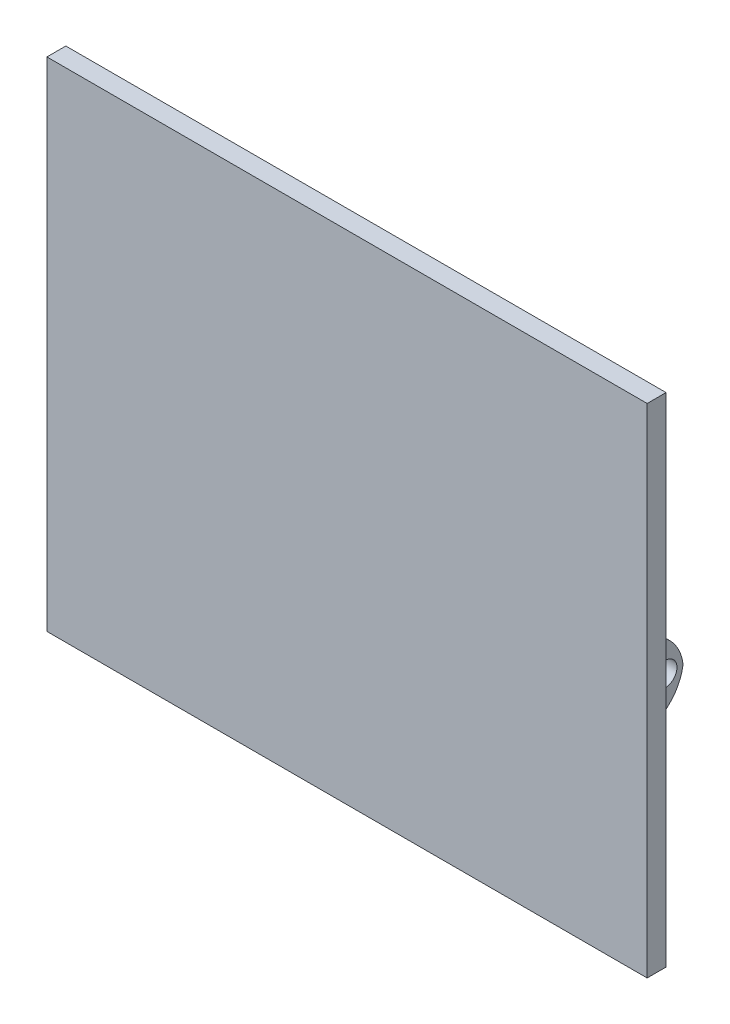
ISO-10303-21;
HEADER;
FILE_DESCRIPTION(('STEP AP214'),'2;1');
FILE_NAME('part.step','',(''),(''),'','','');
FILE_SCHEMA(('AUTOMOTIVE_DESIGN { 1 0 10303 214 1 1 1 1 }'));
ENDSEC;
DATA;
#1=APPLICATION_CONTEXT('core data for automotive mechanical design processes');
#2=APPLICATION_PROTOCOL_DEFINITION('international standard','automotive_design',2000,#1);
#3=PRODUCT_CONTEXT('',#1,'mechanical');
#4=PRODUCT('Part','Part','',(#3));
#5=PRODUCT_RELATED_PRODUCT_CATEGORY('part','',(#4));
#6=PRODUCT_DEFINITION_FORMATION('','',#4);
#7=PRODUCT_DEFINITION_CONTEXT('part definition',#1,'design');
#8=PRODUCT_DEFINITION('design','',#6,#7);
#9=PRODUCT_DEFINITION_SHAPE('','',#8);
#10=(LENGTH_UNIT() NAMED_UNIT(*) SI_UNIT(.MILLI.,.METRE.));
#11=(NAMED_UNIT(*) PLANE_ANGLE_UNIT() SI_UNIT($,.RADIAN.));
#12=(NAMED_UNIT(*) SI_UNIT($,.STERADIAN.) SOLID_ANGLE_UNIT());
#13=UNCERTAINTY_MEASURE_WITH_UNIT(LENGTH_MEASURE(1.E-05),#10,'distance_accuracy_value','');
#14=(GEOMETRIC_REPRESENTATION_CONTEXT(3) GLOBAL_UNCERTAINTY_ASSIGNED_CONTEXT((#13)) GLOBAL_UNIT_ASSIGNED_CONTEXT((#10,
#11,#12)) REPRESENTATION_CONTEXT('',''));
#15=CARTESIAN_POINT('',(0.,0.,0.));
#16=DIRECTION('',(0.,0.,1.));
#17=DIRECTION('',(1.,0.,0.));
#18=AXIS2_PLACEMENT_3D('',#15,#16,#17);
#19=CARTESIAN_POINT('',(0.,0.,25.));
#20=DIRECTION('',(0.,0.,1.));
#21=DIRECTION('',(1.,0.,0.));
#22=AXIS2_PLACEMENT_3D('',#19,#20,#21);
#23=PLANE('',#22);
#24=DIRECTION('',(0.,-1.,0.));
#25=VECTOR('',#24,1.);
#26=CARTESIAN_POINT('',(62.565,80.28,25.));
#27=LINE('',#26,#25);
#28=CARTESIAN_POINT('',(62.565,75.924,25.));
#29=VERTEX_POINT('',#28);
#30=CARTESIAN_POINT('',(62.565,27.78,25.));
#31=VERTEX_POINT('',#30);
#32=EDGE_CURVE('E176',#29,#31,#27,.T.);
#33=ORIENTED_EDGE('',*,*,#32,.F.);
#34=DIRECTION('',(-1.,0.,0.));
#35=VECTOR('',#34,1.);
#36=CARTESIAN_POINT('',(63.065,75.924,25.));
#37=LINE('',#36,#35);
#38=CARTESIAN_POINT('',(58.065,75.924,25.));
#39=VERTEX_POINT('',#38);
#40=EDGE_CURVE('E153',#29,#39,#37,.T.);
#41=ORIENTED_EDGE('',*,*,#40,.T.);
#42=DIRECTION('',(0.,-1.,0.));
#43=VECTOR('',#42,1.);
#44=CARTESIAN_POINT('',(58.065,80.424,25.));
#45=LINE('',#44,#43);
#46=CARTESIAN_POINT('',(58.065,80.424,25.));
#47=VERTEX_POINT('',#46);
#48=EDGE_CURVE('E178',#47,#39,#45,.T.);
#49=ORIENTED_EDGE('',*,*,#48,.F.);
#50=DIRECTION('',(-1.,0.,0.));
#51=VECTOR('',#50,1.);
#52=CARTESIAN_POINT('',(58.065,80.424,25.));
#53=LINE('',#52,#51);
#54=CARTESIAN_POINT('',(121.572,80.424,25.));
#55=VERTEX_POINT('',#54);
#56=EDGE_CURVE('E183',#55,#47,#53,.T.);
#57=ORIENTED_EDGE('',*,*,#56,.F.);
#58=DIRECTION('',(0.,1.,0.));
#59=VECTOR('',#58,1.);
#60=CARTESIAN_POINT('',(121.572,80.424,25.));
#61=LINE('',#60,#59);
#62=CARTESIAN_POINT('',(121.572,27.78,25.));
#63=VERTEX_POINT('',#62);
#64=EDGE_CURVE('E194',#63,#55,#61,.T.);
#65=ORIENTED_EDGE('',*,*,#64,.F.);
#66=DIRECTION('',(1.,0.,0.));
#67=VECTOR('',#66,1.);
#68=CARTESIAN_POINT('',(58.065,27.78,25.));
#69=LINE('',#68,#67);
#70=EDGE_CURVE('E192',#31,#63,#69,.T.);
#71=ORIENTED_EDGE('',*,*,#70,.F.);
#72=EDGE_LOOP('',(#33,#41,#49,#57,#65,#71));
#73=FACE_BOUND('',#72,.T.);
#74=DIRECTION('',(0.,-1.,0.));
#75=VECTOR('',#74,1.);
#76=CARTESIAN_POINT('',(117.072,56.852,25.));
#77=LINE('',#76,#75);
#78=CARTESIAN_POINT('',(117.072,56.852,25.));
#79=VERTEX_POINT('',#78);
#80=CARTESIAN_POINT('',(117.072,48.4243466271709,25.));
#81=VERTEX_POINT('',#80);
#82=EDGE_CURVE('E137',#79,#81,#77,.T.);
#83=ORIENTED_EDGE('',*,*,#82,.T.);
#84=DIRECTION('',(1.,0.,0.));
#85=VECTOR('',#84,1.);
#86=CARTESIAN_POINT('',(117.072,48.4243466271709,25.));
#87=LINE('',#86,#85);
#88=CARTESIAN_POINT('',(119.572,48.4243466271709,25.));
#89=VERTEX_POINT('',#88);
#90=EDGE_CURVE('E145',#81,#89,#87,.T.);
#91=ORIENTED_EDGE('',*,*,#90,.T.);
#92=DIRECTION('',(0.,-1.,0.));
#93=VECTOR('',#92,1.);
#94=CARTESIAN_POINT('',(119.572,56.852,25.));
#95=LINE('',#94,#93);
#96=CARTESIAN_POINT('',(119.572,56.852,25.));
#97=VERTEX_POINT('',#96);
#98=EDGE_CURVE('E142',#97,#89,#95,.T.);
#99=ORIENTED_EDGE('',*,*,#98,.F.);
#100=DIRECTION('',(1.,0.,0.));
#101=VECTOR('',#100,1.);
#102=CARTESIAN_POINT('',(117.072,56.852,25.));
#103=LINE('',#102,#101);
#104=EDGE_CURVE('E135',#79,#97,#103,.T.);
#105=ORIENTED_EDGE('',*,*,#104,.F.);
#106=EDGE_LOOP('',(#83,#91,#99,#105));
#107=FACE_BOUND('',#106,.T.);
#108=ADVANCED_FACE('F32',(#73,#107),#23,.F.);
#109=CARTESIAN_POINT('',(58.065,80.424,27.));
#110=DIRECTION('',(1.,0.,0.));
#111=DIRECTION('',(0.,0.,-1.));
#112=AXIS2_PLACEMENT_3D('',#109,#110,#111);
#113=PLANE('',#112);
#114=DIRECTION('',(0.,0.,1.));
#115=VECTOR('',#114,1.);
#116=CARTESIAN_POINT('',(58.065,75.924,25.));
#117=LINE('',#116,#115);
#118=CARTESIAN_POINT('',(58.065,75.924,22.1559087588293));
#119=VERTEX_POINT('',#118);
#120=EDGE_CURVE('E147',#119,#39,#117,.T.);
#121=ORIENTED_EDGE('',*,*,#120,.F.);
#122=DIRECTION('',(0.,-1.,0.));
#123=VECTOR('',#122,1.);
#124=CARTESIAN_POINT('',(58.065,32.28,22.1559087588293));
#125=LINE('',#124,#123);
#126=CARTESIAN_POINT('',(58.065,32.28,22.1559087588293));
#127=VERTEX_POINT('',#126);
#128=EDGE_CURVE('E213',#119,#127,#125,.T.);
#129=ORIENTED_EDGE('',*,*,#128,.T.);
#130=DIRECTION('',(0.,0.,-1.));
#131=VECTOR('',#130,1.);
#132=CARTESIAN_POINT('',(58.065,32.28,21.1559087588293));
#133=LINE('',#132,#131);
#134=CARTESIAN_POINT('',(58.065,32.28,24.9959087588293));
#135=VERTEX_POINT('',#134);
#136=EDGE_CURVE('E164',#135,#127,#133,.T.);
#137=ORIENTED_EDGE('',*,*,#136,.F.);
#138=DIRECTION('',(0.,1.,0.));
#139=VECTOR('',#138,1.);
#140=CARTESIAN_POINT('',(58.065,27.78,24.9959087588293));
#141=LINE('',#140,#139);
#142=CARTESIAN_POINT('',(58.065,27.78,24.9959087588293));
#143=VERTEX_POINT('',#142);
#144=EDGE_CURVE('E161',#143,#135,#141,.T.);
#145=ORIENTED_EDGE('',*,*,#144,.F.);
#146=DIRECTION('',(0.,0.,-1.));
#147=VECTOR('',#146,1.);
#148=CARTESIAN_POINT('',(58.065,27.78,27.));
#149=LINE('',#148,#147);
#150=CARTESIAN_POINT('',(58.065,27.78,27.));
#151=VERTEX_POINT('',#150);
#152=EDGE_CURVE('E205',#151,#143,#149,.T.);
#153=ORIENTED_EDGE('',*,*,#152,.F.);
#154=DIRECTION('',(0.,-1.,0.));
#155=VECTOR('',#154,1.);
#156=CARTESIAN_POINT('',(58.065,80.424,27.));
#157=LINE('',#156,#155);
#158=CARTESIAN_POINT('',(58.065,80.424,27.));
#159=VERTEX_POINT('',#158);
#160=EDGE_CURVE('E179',#159,#151,#157,.T.);
#161=ORIENTED_EDGE('',*,*,#160,.F.);
#162=DIRECTION('',(0.,0.,-1.));
#163=VECTOR('',#162,1.);
#164=CARTESIAN_POINT('',(58.065,80.424,27.));
#165=LINE('',#164,#163);
#166=EDGE_CURVE('E189',#159,#47,#165,.T.);
#167=ORIENTED_EDGE('',*,*,#166,.T.);
#168=ORIENTED_EDGE('',*,*,#48,.T.);
#169=EDGE_LOOP('',(#121,#129,#137,#145,#153,#161,#167,#168));
#170=FACE_BOUND('',#169,.T.);
#171=ADVANCED_FACE('F272',(#170),#113,.F.);
#172=CARTESIAN_POINT('',(58.065,27.78,27.));
#173=DIRECTION('',(0.,1.,0.));
#174=DIRECTION('',(0.,0.,1.));
#175=AXIS2_PLACEMENT_3D('',#172,#173,#174);
#176=PLANE('',#175);
#177=ORIENTED_EDGE('',*,*,#152,.T.);
#178=DIRECTION('',(-1.,0.,0.));
#179=VECTOR('',#178,1.);
#180=CARTESIAN_POINT('',(63.065,27.78,24.9959087588293));
#181=LINE('',#180,#179);
#182=CARTESIAN_POINT('',(62.565,27.78,24.9959087588293));
#183=VERTEX_POINT('',#182);
#184=EDGE_CURVE('E167',#183,#143,#181,.T.);
#185=ORIENTED_EDGE('',*,*,#184,.F.);
#186=DIRECTION('',(0.,0.,1.));
#187=VECTOR('',#186,1.);
#188=CARTESIAN_POINT('',(62.565,27.78,25.));
#189=LINE('',#188,#187);
#190=EDGE_CURVE('E173',#183,#31,#189,.T.);
#191=ORIENTED_EDGE('',*,*,#190,.T.);
#192=ORIENTED_EDGE('',*,*,#70,.T.);
#193=DIRECTION('',(0.,0.,-1.));
#194=VECTOR('',#193,1.);
#195=CARTESIAN_POINT('',(121.572,27.78,27.));
#196=LINE('',#195,#194);
#197=CARTESIAN_POINT('',(121.572,27.78,27.));
#198=VERTEX_POINT('',#197);
#199=EDGE_CURVE('E202',#198,#63,#196,.T.);
#200=ORIENTED_EDGE('',*,*,#199,.F.);
#201=DIRECTION('',(1.,0.,0.));
#202=VECTOR('',#201,1.);
#203=CARTESIAN_POINT('',(58.065,27.78,27.));
#204=LINE('',#203,#202);
#205=EDGE_CURVE('E182',#151,#198,#204,.T.);
#206=ORIENTED_EDGE('',*,*,#205,.F.);
#207=EDGE_LOOP('',(#177,#185,#191,#192,#200,#206));
#208=FACE_BOUND('',#207,.T.);
#209=ADVANCED_FACE('F278',(#208),#176,.F.);
#210=CARTESIAN_POINT('',(121.572,80.424,27.));
#211=DIRECTION('',(-1.,0.,0.));
#212=DIRECTION('',(0.,0.,1.));
#213=AXIS2_PLACEMENT_3D('',#210,#211,#212);
#214=PLANE('',#213);
#215=ORIENTED_EDGE('',*,*,#64,.T.);
#216=DIRECTION('',(0.,0.,-1.));
#217=VECTOR('',#216,1.);
#218=CARTESIAN_POINT('',(121.572,80.424,27.));
#219=LINE('',#218,#217);
#220=CARTESIAN_POINT('',(121.572,80.424,27.));
#221=VERTEX_POINT('',#220);
#222=EDGE_CURVE('E199',#221,#55,#219,.T.);
#223=ORIENTED_EDGE('',*,*,#222,.F.);
#224=DIRECTION('',(0.,1.,0.));
#225=VECTOR('',#224,1.);
#226=CARTESIAN_POINT('',(121.572,80.424,27.));
#227=LINE('',#226,#225);
#228=EDGE_CURVE('E185',#198,#221,#227,.T.);
#229=ORIENTED_EDGE('',*,*,#228,.F.);
#230=ORIENTED_EDGE('',*,*,#199,.T.);
#231=EDGE_LOOP('',(#215,#223,#229,#230));
#232=FACE_BOUND('',#231,.T.);
#233=ADVANCED_FACE('F289',(#232),#214,.F.);
#234=CARTESIAN_POINT('',(58.065,80.424,27.));
#235=DIRECTION('',(0.,-1.,0.));
#236=DIRECTION('',(0.,0.,-1.));
#237=AXIS2_PLACEMENT_3D('',#234,#235,#236);
#238=PLANE('',#237);
#239=ORIENTED_EDGE('',*,*,#56,.T.);
#240=ORIENTED_EDGE('',*,*,#166,.F.);
#241=DIRECTION('',(-1.,0.,0.));
#242=VECTOR('',#241,1.);
#243=CARTESIAN_POINT('',(58.065,80.424,27.));
#244=LINE('',#243,#242);
#245=EDGE_CURVE('E187',#221,#159,#244,.T.);
#246=ORIENTED_EDGE('',*,*,#245,.F.);
#247=ORIENTED_EDGE('',*,*,#222,.T.);
#248=EDGE_LOOP('',(#239,#240,#246,#247));
#249=FACE_BOUND('',#248,.T.);
#250=ADVANCED_FACE('F286',(#249),#238,.F.);
#251=CARTESIAN_POINT('',(0.,0.,27.));
#252=DIRECTION('',(0.,0.,1.));
#253=DIRECTION('',(1.,0.,0.));
#254=AXIS2_PLACEMENT_3D('',#251,#252,#253);
#255=PLANE('',#254);
#256=ORIENTED_EDGE('',*,*,#160,.T.);
#257=ORIENTED_EDGE('',*,*,#205,.T.);
#258=ORIENTED_EDGE('',*,*,#228,.T.);
#259=ORIENTED_EDGE('',*,*,#245,.T.);
#260=EDGE_LOOP('',(#256,#257,#258,#259));
#261=FACE_BOUND('',#260,.T.);
#262=ADVANCED_FACE('F284',(#261),#255,.T.);
#263=CARTESIAN_POINT('',(62.565,80.28,25.));
#264=DIRECTION('',(1.,0.,0.));
#265=DIRECTION('',(0.,0.,-1.));
#266=AXIS2_PLACEMENT_3D('',#263,#264,#265);
#267=PLANE('',#266);
#268=DIRECTION('',(0.,0.,1.));
#269=VECTOR('',#268,1.);
#270=CARTESIAN_POINT('',(62.565,32.28,25.));
#271=LINE('',#270,#269);
#272=CARTESIAN_POINT('',(62.565,32.28,22.1559087588293));
#273=VERTEX_POINT('',#272);
#274=CARTESIAN_POINT('',(62.565,32.28,24.9959087588293));
#275=VERTEX_POINT('',#274);
#276=EDGE_CURVE('E170',#273,#275,#271,.T.);
#277=ORIENTED_EDGE('',*,*,#276,.F.);
#278=DIRECTION('',(0.,-1.,0.));
#279=VECTOR('',#278,1.);
#280=CARTESIAN_POINT('',(62.565,80.28,22.1559087588293));
#281=LINE('',#280,#279);
#282=CARTESIAN_POINT('',(62.565,75.924,22.1559087588293));
#283=VERTEX_POINT('',#282);
#284=EDGE_CURVE('E229',#273,#283,#281,.F.);
#285=ORIENTED_EDGE('',*,*,#284,.T.);
#286=DIRECTION('',(0.,0.,-1.));
#287=VECTOR('',#286,1.);
#288=CARTESIAN_POINT('',(62.565,75.924,25.));
#289=LINE('',#288,#287);
#290=EDGE_CURVE('E156',#29,#283,#289,.T.);
#291=ORIENTED_EDGE('',*,*,#290,.F.);
#292=ORIENTED_EDGE('',*,*,#32,.T.);
#293=ORIENTED_EDGE('',*,*,#190,.F.);
#294=DIRECTION('',(0.,-1.,0.));
#295=VECTOR('',#294,1.);
#296=CARTESIAN_POINT('',(62.565,80.28,24.9959087588293));
#297=LINE('',#296,#295);
#298=EDGE_CURVE('E211',#275,#183,#297,.T.);
#299=ORIENTED_EDGE('',*,*,#298,.F.);
#300=EDGE_LOOP('',(#277,#285,#291,#292,#293,#299));
#301=FACE_BOUND('',#300,.T.);
#302=ADVANCED_FACE('F407',(#301),#267,.T.);
#303=CARTESIAN_POINT('',(58.065,80.28,21.1559087588293));
#304=DIRECTION('',(0.,0.,-1.));
#305=DIRECTION('',(-1.,0.,0.));
#306=AXIS2_PLACEMENT_3D('',#303,#304,#305);
#307=PLANE('',#306);
#308=DIRECTION('',(1.,0.,0.));
#309=VECTOR('',#308,1.);
#310=CARTESIAN_POINT('',(58.065,32.28,21.1559087588293));
#311=LINE('',#310,#309);
#312=CARTESIAN_POINT('',(59.065,32.28,21.1559087588293));
#313=VERTEX_POINT('',#312);
#314=CARTESIAN_POINT('',(61.565,32.28,21.1559087588293));
#315=VERTEX_POINT('',#314);
#316=EDGE_CURVE('E208',#313,#315,#311,.T.);
#317=ORIENTED_EDGE('',*,*,#316,.F.);
#318=DIRECTION('',(0.,-1.,0.));
#319=VECTOR('',#318,1.);
#320=CARTESIAN_POINT('',(59.065,75.924,21.1559087588293));
#321=LINE('',#320,#319);
#322=CARTESIAN_POINT('',(59.065,75.924,21.1559087588293));
#323=VERTEX_POINT('',#322);
#324=EDGE_CURVE('E223',#313,#323,#321,.F.);
#325=ORIENTED_EDGE('',*,*,#324,.T.);
#326=DIRECTION('',(-1.,0.,0.));
#327=VECTOR('',#326,1.);
#328=CARTESIAN_POINT('',(63.065,75.924,21.1559087588293));
#329=LINE('',#328,#327);
#330=CARTESIAN_POINT('',(61.565,75.924,21.1559087588293));
#331=VERTEX_POINT('',#330);
#332=EDGE_CURVE('E152',#331,#323,#329,.T.);
#333=ORIENTED_EDGE('',*,*,#332,.F.);
#334=DIRECTION('',(0.,-1.,0.));
#335=VECTOR('',#334,1.);
#336=CARTESIAN_POINT('',(61.565,80.28,21.1559087588293));
#337=LINE('',#336,#335);
#338=EDGE_CURVE('E220',#331,#315,#337,.T.);
#339=ORIENTED_EDGE('',*,*,#338,.T.);
#340=EDGE_LOOP('',(#317,#325,#333,#339));
#341=FACE_BOUND('',#340,.T.);
#342=ADVANCED_FACE('F397',(#341),#307,.T.);
#343=CARTESIAN_POINT('',(63.065,32.28,21.1559087588293));
#344=DIRECTION('',(0.,1.,0.));
#345=DIRECTION('',(0.,0.,1.));
#346=AXIS2_PLACEMENT_3D('',#343,#344,#345);
#347=PLANE('',#346);
#348=CARTESIAN_POINT('',(60.565,32.28,23.2959087588293));
#349=DIRECTION('',(0.,-1.,0.));
#350=DIRECTION('',(0.,0.,-1.));
#351=AXIS2_PLACEMENT_3D('',#348,#349,#350);
#352=CIRCLE('',#351,1.25);
#353=CARTESIAN_POINT('',(60.565,32.28,22.0459087588293));
#354=VERTEX_POINT('',#353);
#355=EDGE_CURVE('E238',#354,#354,#352,.T.);
#356=ORIENTED_EDGE('',*,*,#355,.F.);
#357=EDGE_LOOP('',(#356));
#358=FACE_BOUND('',#357,.T.);
#359=ORIENTED_EDGE('',*,*,#136,.T.);
#360=CARTESIAN_POINT('',(59.065,32.28,22.1559087588293));
#361=DIRECTION('',(0.,1.,0.));
#362=DIRECTION('',(0.,0.,1.));
#363=AXIS2_PLACEMENT_3D('',#360,#361,#362);
#364=CIRCLE('',#363,1.);
#365=EDGE_CURVE('E218',#127,#313,#364,.F.);
#366=ORIENTED_EDGE('',*,*,#365,.T.);
#367=ORIENTED_EDGE('',*,*,#316,.T.);
#368=CARTESIAN_POINT('',(61.565,32.28,22.1559087588293));
#369=DIRECTION('',(0.,1.,0.));
#370=DIRECTION('',(0.,0.,1.));
#371=AXIS2_PLACEMENT_3D('',#368,#369,#370);
#372=CIRCLE('',#371,1.);
#373=EDGE_CURVE('E216',#315,#273,#372,.F.);
#374=ORIENTED_EDGE('',*,*,#373,.T.);
#375=ORIENTED_EDGE('',*,*,#276,.T.);
#376=DIRECTION('',(-1.,0.,0.));
#377=VECTOR('',#376,1.);
#378=CARTESIAN_POINT('',(63.065,32.28,24.9959087588293));
#379=LINE('',#378,#377);
#380=EDGE_CURVE('E168',#275,#135,#379,.T.);
#381=ORIENTED_EDGE('',*,*,#380,.T.);
#382=EDGE_LOOP('',(#359,#366,#367,#374,#375,#381));
#383=FACE_BOUND('',#382,.T.);
#384=ADVANCED_FACE('F394',(#358,#383),#347,.F.);
#385=CARTESIAN_POINT('',(63.065,27.78,24.9959087588293));
#386=DIRECTION('',(0.,0.,1.));
#387=DIRECTION('',(1.,0.,0.));
#388=AXIS2_PLACEMENT_3D('',#385,#386,#387);
#389=PLANE('',#388);
#390=ORIENTED_EDGE('',*,*,#298,.T.);
#391=ORIENTED_EDGE('',*,*,#184,.T.);
#392=ORIENTED_EDGE('',*,*,#144,.T.);
#393=ORIENTED_EDGE('',*,*,#380,.F.);
#394=EDGE_LOOP('',(#390,#391,#392,#393));
#395=FACE_BOUND('',#394,.T.);
#396=ADVANCED_FACE('F354',(#395),#389,.F.);
#397=CARTESIAN_POINT('',(63.065,75.924,25.));
#398=DIRECTION('',(0.,-1.,0.));
#399=DIRECTION('',(0.,0.,-1.));
#400=AXIS2_PLACEMENT_3D('',#397,#398,#399);
#401=PLANE('',#400);
#402=CARTESIAN_POINT('',(60.565,75.924,23.2959087588293));
#403=DIRECTION('',(0.,1.,0.));
#404=DIRECTION('',(0.,0.,1.));
#405=AXIS2_PLACEMENT_3D('',#402,#403,#404);
#406=CIRCLE('',#405,1.25);
#407=CARTESIAN_POINT('',(60.565,75.924,24.5459087588293));
#408=VERTEX_POINT('',#407);
#409=EDGE_CURVE('E246',#408,#408,#406,.T.);
#410=ORIENTED_EDGE('',*,*,#409,.F.);
#411=EDGE_LOOP('',(#410));
#412=FACE_BOUND('',#411,.T.);
#413=ORIENTED_EDGE('',*,*,#332,.T.);
#414=CARTESIAN_POINT('',(59.065,75.924,22.1559087588293));
#415=DIRECTION('',(0.,-1.,0.));
#416=DIRECTION('',(0.,0.,-1.));
#417=AXIS2_PLACEMENT_3D('',#414,#415,#416);
#418=CIRCLE('',#417,1.);
#419=EDGE_CURVE('E227',#323,#119,#418,.F.);
#420=ORIENTED_EDGE('',*,*,#419,.T.);
#421=ORIENTED_EDGE('',*,*,#120,.T.);
#422=ORIENTED_EDGE('',*,*,#40,.F.);
#423=ORIENTED_EDGE('',*,*,#290,.T.);
#424=CARTESIAN_POINT('',(61.565,75.924,22.1559087588293));
#425=DIRECTION('',(0.,-1.,0.));
#426=DIRECTION('',(0.,0.,-1.));
#427=AXIS2_PLACEMENT_3D('',#424,#425,#426);
#428=CIRCLE('',#427,1.);
#429=EDGE_CURVE('E225',#283,#331,#428,.F.);
#430=ORIENTED_EDGE('',*,*,#429,.T.);
#431=EDGE_LOOP('',(#413,#420,#421,#422,#423,#430));
#432=FACE_BOUND('',#431,.T.);
#433=ADVANCED_FACE('F300',(#412,#432),#401,.F.);
#434=CARTESIAN_POINT('',(59.065,80.424,22.1559087588293));
#435=DIRECTION('',(0.,1.,0.));
#436=DIRECTION('',(0.,0.,1.));
#437=AXIS2_PLACEMENT_3D('',#434,#435,#436);
#438=CYLINDRICAL_SURFACE('',#437,1.);
#439=ORIENTED_EDGE('',*,*,#419,.F.);
#440=ORIENTED_EDGE('',*,*,#324,.F.);
#441=ORIENTED_EDGE('',*,*,#365,.F.);
#442=ORIENTED_EDGE('',*,*,#128,.F.);
#443=EDGE_LOOP('',(#439,#440,#441,#442));
#444=FACE_BOUND('',#443,.T.);
#445=ADVANCED_FACE('F297',(#444),#438,.T.);
#446=CARTESIAN_POINT('',(61.565,80.28,22.1559087588293));
#447=DIRECTION('',(0.,-1.,0.));
#448=DIRECTION('',(0.,0.,-1.));
#449=AXIS2_PLACEMENT_3D('',#446,#447,#448);
#450=CYLINDRICAL_SURFACE('',#449,1.);
#451=ORIENTED_EDGE('',*,*,#429,.F.);
#452=ORIENTED_EDGE('',*,*,#284,.F.);
#453=ORIENTED_EDGE('',*,*,#373,.F.);
#454=ORIENTED_EDGE('',*,*,#338,.F.);
#455=EDGE_LOOP('',(#451,#452,#453,#454));
#456=FACE_BOUND('',#455,.T.);
#457=ADVANCED_FACE('F267',(#456),#450,.T.);
#458=CARTESIAN_POINT('',(117.072,0.,0.));
#459=DIRECTION('',(1.,0.,0.));
#460=DIRECTION('',(0.,0.,-1.));
#461=AXIS2_PLACEMENT_3D('',#458,#459,#460);
#462=PLANE('',#461);
#463=CARTESIAN_POINT('',(117.072,52.6669216408011,23.107660130267));
#464=DIRECTION('',(1.,0.,0.));
#465=DIRECTION('',(0.,0.,-1.));
#466=AXIS2_PLACEMENT_3D('',#463,#464,#465);
#467=CIRCLE('',#466,1.26021761982163);
#468=CARTESIAN_POINT('',(117.072,52.6669216408011,21.8474425104454));
#469=VERTEX_POINT('',#468);
#470=EDGE_CURVE('E249',#469,#469,#467,.T.);
#471=ORIENTED_EDGE('',*,*,#470,.T.);
#472=EDGE_LOOP('',(#471));
#473=FACE_BOUND('',#472,.T.);
#474=ORIENTED_EDGE('',*,*,#82,.F.);
#475=CARTESIAN_POINT('',(117.072,51.9874470974959,26.1559087588293));
#476=DIRECTION('',(1.,0.,0.));
#477=DIRECTION('',(0.,0.,-1.));
#478=AXIS2_PLACEMENT_3D('',#475,#476,#477);
#479=CIRCLE('',#478,5.);
#480=CARTESIAN_POINT('',(117.072,52.6381733135855,21.1984340597821));
#481=VERTEX_POINT('',#480);
#482=EDGE_CURVE('E11',#79,#481,#479,.F.);
#483=ORIENTED_EDGE('',*,*,#482,.T.);
#484=CARTESIAN_POINT('',(117.072,53.2888995296751,26.1559087588293));
#485=DIRECTION('',(1.,0.,0.));
#486=DIRECTION('',(0.,0.,-1.));
#487=AXIS2_PLACEMENT_3D('',#484,#485,#486);
#488=CIRCLE('',#487,5.);
#489=EDGE_CURVE('E41',#481,#81,#488,.F.);
#490=ORIENTED_EDGE('',*,*,#489,.T.);
#491=EDGE_LOOP('',(#474,#483,#490));
#492=FACE_BOUND('',#491,.T.);
#493=ADVANCED_FACE('F138',(#473,#492),#462,.F.);
#494=CARTESIAN_POINT('',(119.572,0.,0.));
#495=DIRECTION('',(1.,0.,0.));
#496=DIRECTION('',(0.,0.,-1.));
#497=AXIS2_PLACEMENT_3D('',#494,#495,#496);
#498=PLANE('',#497);
#499=CARTESIAN_POINT('',(119.572,52.6669216408011,23.107660130267));
#500=DIRECTION('',(1.,0.,0.));
#501=DIRECTION('',(0.,0.,-1.));
#502=AXIS2_PLACEMENT_3D('',#499,#500,#501);
#503=CIRCLE('',#502,1.26021761982163);
#504=CARTESIAN_POINT('',(119.572,52.6669216408011,21.8474425104454));
#505=VERTEX_POINT('',#504);
#506=EDGE_CURVE('E254',#505,#505,#503,.T.);
#507=ORIENTED_EDGE('',*,*,#506,.F.);
#508=EDGE_LOOP('',(#507));
#509=FACE_BOUND('',#508,.T.);
#510=CARTESIAN_POINT('',(119.572,53.2888995296751,26.1559087588293));
#511=DIRECTION('',(1.,0.,0.));
#512=DIRECTION('',(0.,0.,-1.));
#513=AXIS2_PLACEMENT_3D('',#510,#511,#512);
#514=CIRCLE('',#513,5.);
#515=CARTESIAN_POINT('',(119.572,52.6381733135855,21.1984340597821));
#516=VERTEX_POINT('',#515);
#517=EDGE_CURVE('E54',#89,#516,#514,.T.);
#518=ORIENTED_EDGE('',*,*,#517,.T.);
#519=CARTESIAN_POINT('',(119.572,51.9874470974959,26.1559087588293));
#520=DIRECTION('',(1.,0.,0.));
#521=DIRECTION('',(0.,0.,-1.));
#522=AXIS2_PLACEMENT_3D('',#519,#520,#521);
#523=CIRCLE('',#522,5.);
#524=EDGE_CURVE('E232',#516,#97,#523,.T.);
#525=ORIENTED_EDGE('',*,*,#524,.T.);
#526=ORIENTED_EDGE('',*,*,#98,.T.);
#527=EDGE_LOOP('',(#518,#525,#526));
#528=FACE_BOUND('',#527,.T.);
#529=ADVANCED_FACE('F234',(#509,#528),#498,.T.);
#530=CARTESIAN_POINT('',(117.072,53.2888995296751,26.1559087588293));
#531=DIRECTION('',(-1.,0.,0.));
#532=DIRECTION('',(0.,0.,1.));
#533=AXIS2_PLACEMENT_3D('',#530,#531,#532);
#534=CYLINDRICAL_SURFACE('',#533,5.);
#535=ORIENTED_EDGE('',*,*,#90,.F.);
#536=ORIENTED_EDGE('',*,*,#489,.F.);
#537=DIRECTION('',(-1.,0.,0.));
#538=VECTOR('',#537,1.);
#539=CARTESIAN_POINT('',(118.322,52.6381733135855,21.1984340597821));
#540=LINE('',#539,#538);
#541=EDGE_CURVE('E36',#516,#481,#540,.T.);
#542=ORIENTED_EDGE('',*,*,#541,.F.);
#543=ORIENTED_EDGE('',*,*,#517,.F.);
#544=EDGE_LOOP('',(#535,#536,#542,#543));
#545=FACE_BOUND('',#544,.T.);
#546=ADVANCED_FACE('F34',(#545),#534,.T.);
#547=CARTESIAN_POINT('',(117.072,51.9874470974959,26.1559087588293));
#548=DIRECTION('',(1.,0.,0.));
#549=DIRECTION('',(0.,0.,-1.));
#550=AXIS2_PLACEMENT_3D('',#547,#548,#549);
#551=CYLINDRICAL_SURFACE('',#550,5.);
#552=ORIENTED_EDGE('',*,*,#482,.F.);
#553=ORIENTED_EDGE('',*,*,#104,.T.);
#554=ORIENTED_EDGE('',*,*,#524,.F.);
#555=ORIENTED_EDGE('',*,*,#541,.T.);
#556=EDGE_LOOP('',(#552,#553,#554,#555));
#557=FACE_BOUND('',#556,.T.);
#558=ADVANCED_FACE('F132',(#557),#551,.T.);
#559=CARTESIAN_POINT('',(60.565,37.28,23.2959087588293));
#560=DIRECTION('',(0.,-1.,0.));
#561=DIRECTION('',(0.,0.,-1.));
#562=AXIS2_PLACEMENT_3D('',#559,#560,#561);
#563=CYLINDRICAL_SURFACE('',#562,1.25);
#564=CARTESIAN_POINT('',(60.565,37.28,23.2959087588293));
#565=DIRECTION('',(0.,-1.,0.));
#566=DIRECTION('',(0.,0.,-1.));
#567=AXIS2_PLACEMENT_3D('',#564,#565,#566);
#568=CIRCLE('',#567,1.25);
#569=CARTESIAN_POINT('',(60.565,37.28,22.0459087588293));
#570=VERTEX_POINT('',#569);
#571=EDGE_CURVE('E236',#570,#570,#568,.T.);
#572=ORIENTED_EDGE('',*,*,#571,.F.);
#573=EDGE_LOOP('',(#572));
#574=FACE_BOUND('',#573,.T.);
#575=ORIENTED_EDGE('',*,*,#355,.T.);
#576=EDGE_LOOP('',(#575));
#577=FACE_BOUND('',#576,.T.);
#578=ADVANCED_FACE('F305',(#574,#577),#563,.F.);
#579=CARTESIAN_POINT('',(60.565,37.28,23.2959087588293));
#580=DIRECTION('',(0.,-1.,0.));
#581=DIRECTION('',(0.,0.,-1.));
#582=AXIS2_PLACEMENT_3D('',#579,#580,#581);
#583=PLANE('',#582);
#584=ORIENTED_EDGE('',*,*,#571,.T.);
#585=EDGE_LOOP('',(#584));
#586=FACE_BOUND('',#585,.T.);
#587=ADVANCED_FACE('F309',(#586),#583,.T.);
#588=CARTESIAN_POINT('',(60.565,70.924,23.2959087588293));
#589=DIRECTION('',(0.,1.,0.));
#590=DIRECTION('',(0.,0.,1.));
#591=AXIS2_PLACEMENT_3D('',#588,#589,#590);
#592=CYLINDRICAL_SURFACE('',#591,1.25);
#593=CARTESIAN_POINT('',(60.565,70.924,23.2959087588293));
#594=DIRECTION('',(0.,1.,0.));
#595=DIRECTION('',(0.,0.,1.));
#596=AXIS2_PLACEMENT_3D('',#593,#594,#595);
#597=CIRCLE('',#596,1.25);
#598=CARTESIAN_POINT('',(60.565,70.924,24.5459087588293));
#599=VERTEX_POINT('',#598);
#600=EDGE_CURVE('E243',#599,#599,#597,.T.);
#601=ORIENTED_EDGE('',*,*,#600,.F.);
#602=EDGE_LOOP('',(#601));
#603=FACE_BOUND('',#602,.T.);
#604=ORIENTED_EDGE('',*,*,#409,.T.);
#605=EDGE_LOOP('',(#604));
#606=FACE_BOUND('',#605,.T.);
#607=ADVANCED_FACE('F315',(#603,#606),#592,.F.);
#608=CARTESIAN_POINT('',(0.,70.924,0.));
#609=DIRECTION('',(0.,1.,0.));
#610=DIRECTION('',(0.,0.,1.));
#611=AXIS2_PLACEMENT_3D('',#608,#609,#610);
#612=PLANE('',#611);
#613=ORIENTED_EDGE('',*,*,#600,.T.);
#614=EDGE_LOOP('',(#613));
#615=FACE_BOUND('',#614,.T.);
#616=ADVANCED_FACE('F321',(#615),#612,.T.);
#617=CARTESIAN_POINT('',(115.572,52.6669216408011,23.107660130267));
#618=DIRECTION('',(1.,0.,0.));
#619=DIRECTION('',(0.,0.,-1.));
#620=AXIS2_PLACEMENT_3D('',#617,#618,#619);
#621=CYLINDRICAL_SURFACE('',#620,1.26021761982163);
#622=ORIENTED_EDGE('',*,*,#506,.T.);
#623=EDGE_LOOP('',(#622));
#624=FACE_BOUND('',#623,.T.);
#625=ORIENTED_EDGE('',*,*,#470,.F.);
#626=EDGE_LOOP('',(#625));
#627=FACE_BOUND('',#626,.T.);
#628=ADVANCED_FACE('F258',(#624,#627),#621,.F.);
#629=CLOSED_SHELL('',(#108,#171,#209,#233,#250,#262,#302,#342,#384,#396,#433,#445,#457,#493,
#529,#546,#558,#578,#587,#607,#616,#628));
#630=MANIFOLD_SOLID_BREP('B2',#629);
#631=ADVANCED_BREP_SHAPE_REPRESENTATION('',(#18,#630),#14);
#632=SHAPE_DEFINITION_REPRESENTATION(#9,#631);
ENDSEC;
END-ISO-10303-21;
